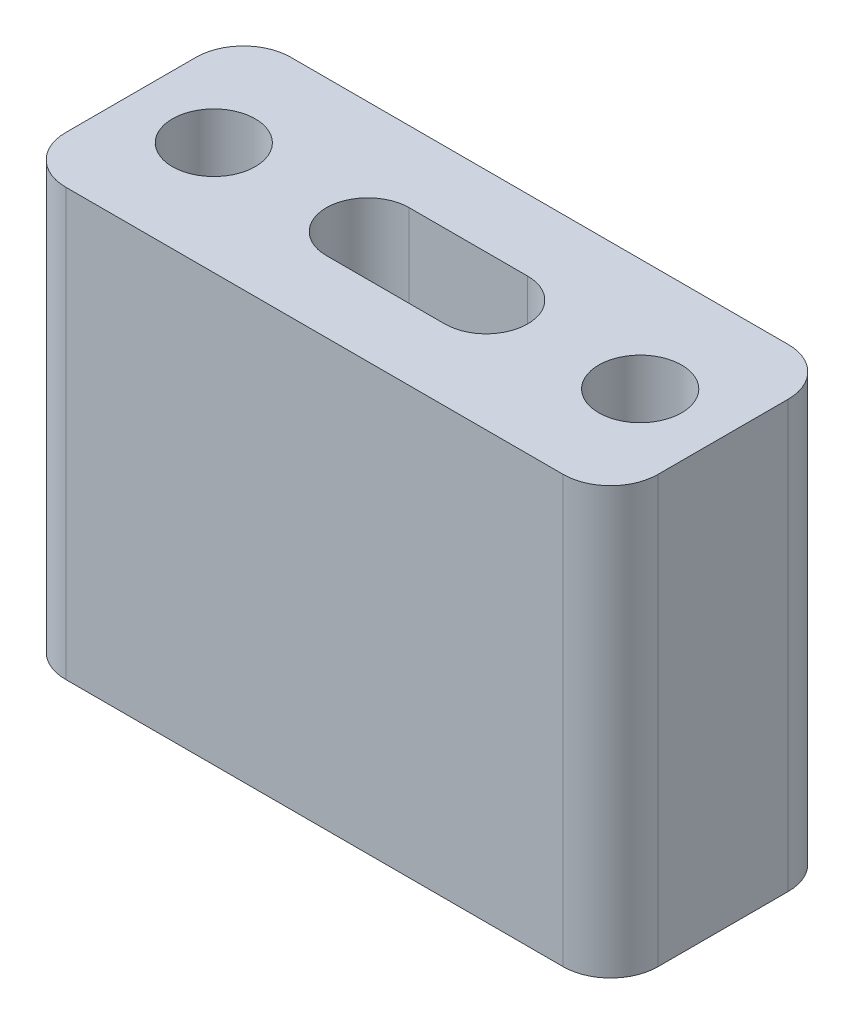
ISO-10303-21;
HEADER;
FILE_DESCRIPTION(('STEP AP214'),'2;1');
FILE_NAME('part.step','',(''),(''),'','','');
FILE_SCHEMA(('AUTOMOTIVE_DESIGN { 1 0 10303 214 1 1 1 1 }'));
ENDSEC;
DATA;
#1=APPLICATION_CONTEXT('core data for automotive mechanical design processes');
#2=APPLICATION_PROTOCOL_DEFINITION('international standard','automotive_design',2000,#1);
#3=PRODUCT_CONTEXT('',#1,'mechanical');
#4=PRODUCT('Part','Part','',(#3));
#5=PRODUCT_RELATED_PRODUCT_CATEGORY('part','',(#4));
#6=PRODUCT_DEFINITION_FORMATION('','',#4);
#7=PRODUCT_DEFINITION_CONTEXT('part definition',#1,'design');
#8=PRODUCT_DEFINITION('design','',#6,#7);
#9=PRODUCT_DEFINITION_SHAPE('','',#8);
#10=(LENGTH_UNIT() NAMED_UNIT(*) SI_UNIT(.MILLI.,.METRE.));
#11=(NAMED_UNIT(*) PLANE_ANGLE_UNIT() SI_UNIT($,.RADIAN.));
#12=(NAMED_UNIT(*) SI_UNIT($,.STERADIAN.) SOLID_ANGLE_UNIT());
#13=UNCERTAINTY_MEASURE_WITH_UNIT(LENGTH_MEASURE(1.E-05),#10,'distance_accuracy_value','');
#14=(GEOMETRIC_REPRESENTATION_CONTEXT(3) GLOBAL_UNCERTAINTY_ASSIGNED_CONTEXT((#13)) GLOBAL_UNIT_ASSIGNED_CONTEXT((#10,
#11,#12)) REPRESENTATION_CONTEXT('',''));
#15=CARTESIAN_POINT('',(0.,0.,0.));
#16=DIRECTION('',(0.,0.,1.));
#17=DIRECTION('',(1.,0.,0.));
#18=AXIS2_PLACEMENT_3D('',#15,#16,#17);
#19=CARTESIAN_POINT('',(0.,18.,0.));
#20=DIRECTION('',(0.,1.,0.));
#21=DIRECTION('',(0.,0.,1.));
#22=AXIS2_PLACEMENT_3D('',#19,#20,#21);
#23=PLANE('',#22);
#24=CARTESIAN_POINT('',(-9.,18.,0.));
#25=DIRECTION('',(0.,1.,0.));
#26=DIRECTION('',(0.,0.,1.));
#27=AXIS2_PLACEMENT_3D('',#24,#25,#26);
#28=CIRCLE('',#27,1.75);
#29=CARTESIAN_POINT('',(-9.,18.,1.75));
#30=VERTEX_POINT('',#29);
#31=EDGE_CURVE('E176',#30,#30,#28,.T.);
#32=ORIENTED_EDGE('',*,*,#31,.F.);
#33=EDGE_LOOP('',(#32));
#34=FACE_BOUND('',#33,.T.);
#35=DIRECTION('',(0.,0.,1.));
#36=VECTOR('',#35,1.);
#37=CARTESIAN_POINT('',(-12.5,18.,-4.75));
#38=LINE('',#37,#36);
#39=CARTESIAN_POINT('',(-12.5,18.,-2.75));
#40=VERTEX_POINT('',#39);
#41=CARTESIAN_POINT('',(-12.5,18.,2.75));
#42=VERTEX_POINT('',#41);
#43=EDGE_CURVE('E187',#40,#42,#38,.T.);
#44=ORIENTED_EDGE('',*,*,#43,.T.);
#45=CARTESIAN_POINT('',(-10.5,18.,2.75));
#46=DIRECTION('',(0.,1.,0.));
#47=DIRECTION('',(0.,0.,1.));
#48=AXIS2_PLACEMENT_3D('',#45,#46,#47);
#49=CIRCLE('',#48,2.);
#50=CARTESIAN_POINT('',(-10.5,18.,4.75));
#51=VERTEX_POINT('',#50);
#52=EDGE_CURVE('E225',#42,#51,#49,.T.);
#53=ORIENTED_EDGE('',*,*,#52,.T.);
#54=DIRECTION('',(1.,0.,0.));
#55=VECTOR('',#54,1.);
#56=CARTESIAN_POINT('',(-12.5,18.,4.75));
#57=LINE('',#56,#55);
#58=CARTESIAN_POINT('',(10.5,18.,4.75));
#59=VERTEX_POINT('',#58);
#60=EDGE_CURVE('E190',#51,#59,#57,.T.);
#61=ORIENTED_EDGE('',*,*,#60,.T.);
#62=CARTESIAN_POINT('',(10.5,18.,2.75));
#63=DIRECTION('',(0.,1.,0.));
#64=DIRECTION('',(0.,0.,1.));
#65=AXIS2_PLACEMENT_3D('',#62,#63,#64);
#66=CIRCLE('',#65,2.);
#67=CARTESIAN_POINT('',(12.5,18.,2.75));
#68=VERTEX_POINT('',#67);
#69=EDGE_CURVE('E220',#59,#68,#66,.T.);
#70=ORIENTED_EDGE('',*,*,#69,.T.);
#71=DIRECTION('',(0.,0.,-1.));
#72=VECTOR('',#71,1.);
#73=CARTESIAN_POINT('',(12.5,18.,-4.75));
#74=LINE('',#73,#72);
#75=CARTESIAN_POINT('',(12.5,18.,-2.75));
#76=VERTEX_POINT('',#75);
#77=EDGE_CURVE('E182',#68,#76,#74,.T.);
#78=ORIENTED_EDGE('',*,*,#77,.T.);
#79=CARTESIAN_POINT('',(10.5,18.,-2.75));
#80=DIRECTION('',(0.,1.,0.));
#81=DIRECTION('',(0.,0.,1.));
#82=AXIS2_PLACEMENT_3D('',#79,#80,#81);
#83=CIRCLE('',#82,2.);
#84=CARTESIAN_POINT('',(10.5,18.,-4.75));
#85=VERTEX_POINT('',#84);
#86=EDGE_CURVE('E60',#76,#85,#83,.T.);
#87=ORIENTED_EDGE('',*,*,#86,.T.);
#88=DIRECTION('',(-1.,0.,0.));
#89=VECTOR('',#88,1.);
#90=CARTESIAN_POINT('',(-12.5,18.,-4.75));
#91=LINE('',#90,#89);
#92=CARTESIAN_POINT('',(-10.5,18.,-4.75));
#93=VERTEX_POINT('',#92);
#94=EDGE_CURVE('E184',#85,#93,#91,.T.);
#95=ORIENTED_EDGE('',*,*,#94,.T.);
#96=CARTESIAN_POINT('',(-10.5,18.,-2.75));
#97=DIRECTION('',(0.,1.,0.));
#98=DIRECTION('',(0.,0.,1.));
#99=AXIS2_PLACEMENT_3D('',#96,#97,#98);
#100=CIRCLE('',#99,2.);
#101=EDGE_CURVE('E223',#93,#40,#100,.T.);
#102=ORIENTED_EDGE('',*,*,#101,.T.);
#103=EDGE_LOOP('',(#44,#53,#61,#70,#78,#87,#95,#102));
#104=FACE_BOUND('',#103,.T.);
#105=CARTESIAN_POINT('',(9.,18.,0.));
#106=DIRECTION('',(0.,1.,0.));
#107=DIRECTION('',(0.,0.,1.));
#108=AXIS2_PLACEMENT_3D('',#105,#106,#107);
#109=CIRCLE('',#108,1.75);
#110=CARTESIAN_POINT('',(9.,18.,1.75));
#111=VERTEX_POINT('',#110);
#112=EDGE_CURVE('E170',#111,#111,#109,.T.);
#113=ORIENTED_EDGE('',*,*,#112,.F.);
#114=EDGE_LOOP('',(#113));
#115=FACE_BOUND('',#114,.T.);
#116=DIRECTION('',(1.,0.,0.));
#117=VECTOR('',#116,1.);
#118=CARTESIAN_POINT('',(-2.5,18.,1.75));
#119=LINE('',#118,#117);
#120=CARTESIAN_POINT('',(-2.5,18.,1.75));
#121=VERTEX_POINT('',#120);
#122=CARTESIAN_POINT('',(2.5,18.,1.75));
#123=VERTEX_POINT('',#122);
#124=EDGE_CURVE('E139',#121,#123,#119,.T.);
#125=ORIENTED_EDGE('',*,*,#124,.F.);
#126=CARTESIAN_POINT('',(-2.5,18.,0.));
#127=DIRECTION('',(0.,1.,0.));
#128=DIRECTION('',(0.,0.,1.));
#129=AXIS2_PLACEMENT_3D('',#126,#127,#128);
#130=CIRCLE('',#129,1.75);
#131=CARTESIAN_POINT('',(-2.5,18.,-1.75));
#132=VERTEX_POINT('',#131);
#133=EDGE_CURVE('E129',#132,#121,#130,.T.);
#134=ORIENTED_EDGE('',*,*,#133,.F.);
#135=DIRECTION('',(-1.,0.,0.));
#136=VECTOR('',#135,1.);
#137=CARTESIAN_POINT('',(-2.5,18.,-1.75));
#138=LINE('',#137,#136);
#139=CARTESIAN_POINT('',(2.5,18.,-1.75));
#140=VERTEX_POINT('',#139);
#141=EDGE_CURVE('E154',#140,#132,#138,.T.);
#142=ORIENTED_EDGE('',*,*,#141,.F.);
#143=CARTESIAN_POINT('',(2.5,18.,0.));
#144=DIRECTION('',(0.,1.,0.));
#145=DIRECTION('',(0.,0.,1.));
#146=AXIS2_PLACEMENT_3D('',#143,#144,#145);
#147=CIRCLE('',#146,1.75);
#148=EDGE_CURVE('E152',#123,#140,#147,.T.);
#149=ORIENTED_EDGE('',*,*,#148,.F.);
#150=EDGE_LOOP('',(#125,#134,#142,#149));
#151=FACE_BOUND('',#150,.T.);
#152=ADVANCED_FACE('F38',(#34,#104,#115,#151),#23,.T.);
#153=CARTESIAN_POINT('',(0.,0.,0.));
#154=DIRECTION('',(0.,1.,0.));
#155=DIRECTION('',(0.,0.,1.));
#156=AXIS2_PLACEMENT_3D('',#153,#154,#155);
#157=PLANE('',#156);
#158=CARTESIAN_POINT('',(9.,0.,0.));
#159=DIRECTION('',(0.,1.,0.));
#160=DIRECTION('',(0.,0.,1.));
#161=AXIS2_PLACEMENT_3D('',#158,#159,#160);
#162=CIRCLE('',#161,1.75);
#163=CARTESIAN_POINT('',(9.,0.,1.75));
#164=VERTEX_POINT('',#163);
#165=EDGE_CURVE('E147',#164,#164,#162,.T.);
#166=ORIENTED_EDGE('',*,*,#165,.T.);
#167=EDGE_LOOP('',(#166));
#168=FACE_BOUND('',#167,.T.);
#169=CARTESIAN_POINT('',(-9.,0.,0.));
#170=DIRECTION('',(0.,1.,0.));
#171=DIRECTION('',(0.,0.,1.));
#172=AXIS2_PLACEMENT_3D('',#169,#170,#171);
#173=CIRCLE('',#172,1.75);
#174=CARTESIAN_POINT('',(-9.,0.,1.75));
#175=VERTEX_POINT('',#174);
#176=EDGE_CURVE('E173',#175,#175,#173,.T.);
#177=ORIENTED_EDGE('',*,*,#176,.T.);
#178=EDGE_LOOP('',(#177));
#179=FACE_BOUND('',#178,.T.);
#180=DIRECTION('',(1.,0.,0.));
#181=VECTOR('',#180,1.);
#182=CARTESIAN_POINT('',(-12.5,0.,4.75));
#183=LINE('',#182,#181);
#184=CARTESIAN_POINT('',(-10.5,0.,4.75));
#185=VERTEX_POINT('',#184);
#186=CARTESIAN_POINT('',(10.5,0.,4.75));
#187=VERTEX_POINT('',#186);
#188=EDGE_CURVE('E185',#185,#187,#183,.T.);
#189=ORIENTED_EDGE('',*,*,#188,.F.);
#190=CARTESIAN_POINT('',(-10.5,0.,2.75));
#191=DIRECTION('',(0.,1.,0.));
#192=DIRECTION('',(0.,0.,1.));
#193=AXIS2_PLACEMENT_3D('',#190,#191,#192);
#194=CIRCLE('',#193,2.);
#195=CARTESIAN_POINT('',(-12.5,0.,2.75));
#196=VERTEX_POINT('',#195);
#197=EDGE_CURVE('E213',#185,#196,#194,.F.);
#198=ORIENTED_EDGE('',*,*,#197,.T.);
#199=DIRECTION('',(0.,0.,1.));
#200=VECTOR('',#199,1.);
#201=CARTESIAN_POINT('',(-12.5,0.,-4.75));
#202=LINE('',#201,#200);
#203=CARTESIAN_POINT('',(-12.5,0.,-2.75));
#204=VERTEX_POINT('',#203);
#205=EDGE_CURVE('E198',#204,#196,#202,.T.);
#206=ORIENTED_EDGE('',*,*,#205,.F.);
#207=CARTESIAN_POINT('',(-10.5,0.,-2.75));
#208=DIRECTION('',(0.,1.,0.));
#209=DIRECTION('',(0.,0.,1.));
#210=AXIS2_PLACEMENT_3D('',#207,#208,#209);
#211=CIRCLE('',#210,2.);
#212=CARTESIAN_POINT('',(-10.5,0.,-4.75));
#213=VERTEX_POINT('',#212);
#214=EDGE_CURVE('E211',#204,#213,#211,.F.);
#215=ORIENTED_EDGE('',*,*,#214,.T.);
#216=DIRECTION('',(-1.,0.,0.));
#217=VECTOR('',#216,1.);
#218=CARTESIAN_POINT('',(-12.5,0.,-4.75));
#219=LINE('',#218,#217);
#220=CARTESIAN_POINT('',(10.5,0.,-4.75));
#221=VERTEX_POINT('',#220);
#222=EDGE_CURVE('E196',#221,#213,#219,.T.);
#223=ORIENTED_EDGE('',*,*,#222,.F.);
#224=CARTESIAN_POINT('',(10.5,0.,-2.75));
#225=DIRECTION('',(0.,1.,0.));
#226=DIRECTION('',(0.,0.,1.));
#227=AXIS2_PLACEMENT_3D('',#224,#225,#226);
#228=CIRCLE('',#227,2.);
#229=CARTESIAN_POINT('',(12.5,0.,-2.75));
#230=VERTEX_POINT('',#229);
#231=EDGE_CURVE('E209',#221,#230,#228,.F.);
#232=ORIENTED_EDGE('',*,*,#231,.T.);
#233=DIRECTION('',(0.,0.,-1.));
#234=VECTOR('',#233,1.);
#235=CARTESIAN_POINT('',(12.5,0.,-4.75));
#236=LINE('',#235,#234);
#237=CARTESIAN_POINT('',(12.5,0.,2.75));
#238=VERTEX_POINT('',#237);
#239=EDGE_CURVE('E179',#238,#230,#236,.T.);
#240=ORIENTED_EDGE('',*,*,#239,.F.);
#241=CARTESIAN_POINT('',(10.5,0.,2.75));
#242=DIRECTION('',(0.,1.,0.));
#243=DIRECTION('',(0.,0.,1.));
#244=AXIS2_PLACEMENT_3D('',#241,#242,#243);
#245=CIRCLE('',#244,2.);
#246=EDGE_CURVE('E207',#238,#187,#245,.F.);
#247=ORIENTED_EDGE('',*,*,#246,.T.);
#248=EDGE_LOOP('',(#189,#198,#206,#215,#223,#232,#240,#247));
#249=FACE_BOUND('',#248,.T.);
#250=CARTESIAN_POINT('',(-2.5,0.,0.));
#251=DIRECTION('',(0.,1.,0.));
#252=DIRECTION('',(0.,0.,1.));
#253=AXIS2_PLACEMENT_3D('',#250,#251,#252);
#254=CIRCLE('',#253,1.75);
#255=CARTESIAN_POINT('',(-2.5,0.,-1.75));
#256=VERTEX_POINT('',#255);
#257=CARTESIAN_POINT('',(-2.5,0.,1.75));
#258=VERTEX_POINT('',#257);
#259=EDGE_CURVE('E158',#256,#258,#254,.T.);
#260=ORIENTED_EDGE('',*,*,#259,.T.);
#261=DIRECTION('',(1.,0.,0.));
#262=VECTOR('',#261,1.);
#263=CARTESIAN_POINT('',(-2.5,0.,1.75));
#264=LINE('',#263,#262);
#265=CARTESIAN_POINT('',(2.5,0.,1.75));
#266=VERTEX_POINT('',#265);
#267=EDGE_CURVE('E146',#258,#266,#264,.T.);
#268=ORIENTED_EDGE('',*,*,#267,.T.);
#269=CARTESIAN_POINT('',(2.5,0.,0.));
#270=DIRECTION('',(0.,1.,0.));
#271=DIRECTION('',(0.,0.,1.));
#272=AXIS2_PLACEMENT_3D('',#269,#270,#271);
#273=CIRCLE('',#272,1.75);
#274=CARTESIAN_POINT('',(2.5,0.,-1.75));
#275=VERTEX_POINT('',#274);
#276=EDGE_CURVE('E161',#266,#275,#273,.T.);
#277=ORIENTED_EDGE('',*,*,#276,.T.);
#278=DIRECTION('',(-1.,0.,0.));
#279=VECTOR('',#278,1.);
#280=CARTESIAN_POINT('',(-2.5,0.,-1.75));
#281=LINE('',#280,#279);
#282=EDGE_CURVE('E140',#275,#256,#281,.T.);
#283=ORIENTED_EDGE('',*,*,#282,.T.);
#284=EDGE_LOOP('',(#260,#268,#277,#283));
#285=FACE_BOUND('',#284,.T.);
#286=ADVANCED_FACE('F241',(#168,#179,#249,#285),#157,.F.);
#287=CARTESIAN_POINT('',(12.5,18.,-4.75));
#288=DIRECTION('',(-1.,0.,0.));
#289=DIRECTION('',(0.,0.,1.));
#290=AXIS2_PLACEMENT_3D('',#287,#288,#289);
#291=PLANE('',#290);
#292=ORIENTED_EDGE('',*,*,#239,.T.);
#293=DIRECTION('',(0.,-1.,0.));
#294=VECTOR('',#293,1.);
#295=CARTESIAN_POINT('',(12.5,18.,-2.75));
#296=LINE('',#295,#294);
#297=EDGE_CURVE('E11',#230,#76,#296,.F.);
#298=ORIENTED_EDGE('',*,*,#297,.T.);
#299=ORIENTED_EDGE('',*,*,#77,.F.);
#300=DIRECTION('',(0.,-1.,0.));
#301=VECTOR('',#300,1.);
#302=CARTESIAN_POINT('',(12.5,18.,2.75));
#303=LINE('',#302,#301);
#304=EDGE_CURVE('E46',#68,#238,#303,.T.);
#305=ORIENTED_EDGE('',*,*,#304,.T.);
#306=EDGE_LOOP('',(#292,#298,#299,#305));
#307=FACE_BOUND('',#306,.T.);
#308=ADVANCED_FACE('F235',(#307),#291,.F.);
#309=CARTESIAN_POINT('',(-12.5,18.,-4.75));
#310=DIRECTION('',(0.,0.,1.));
#311=DIRECTION('',(1.,0.,0.));
#312=AXIS2_PLACEMENT_3D('',#309,#310,#311);
#313=PLANE('',#312);
#314=ORIENTED_EDGE('',*,*,#222,.T.);
#315=DIRECTION('',(0.,-1.,0.));
#316=VECTOR('',#315,1.);
#317=CARTESIAN_POINT('',(-10.5,18.,-4.75));
#318=LINE('',#317,#316);
#319=EDGE_CURVE('E53',#213,#93,#318,.F.);
#320=ORIENTED_EDGE('',*,*,#319,.T.);
#321=ORIENTED_EDGE('',*,*,#94,.F.);
#322=DIRECTION('',(0.,-1.,0.));
#323=VECTOR('',#322,1.);
#324=CARTESIAN_POINT('',(10.5,18.,-4.75));
#325=LINE('',#324,#323);
#326=EDGE_CURVE('E227',#85,#221,#325,.T.);
#327=ORIENTED_EDGE('',*,*,#326,.T.);
#328=EDGE_LOOP('',(#314,#320,#321,#327));
#329=FACE_BOUND('',#328,.T.);
#330=ADVANCED_FACE('F247',(#329),#313,.F.);
#331=CARTESIAN_POINT('',(-12.5,18.,-4.75));
#332=DIRECTION('',(1.,0.,0.));
#333=DIRECTION('',(0.,0.,-1.));
#334=AXIS2_PLACEMENT_3D('',#331,#332,#333);
#335=PLANE('',#334);
#336=ORIENTED_EDGE('',*,*,#205,.T.);
#337=DIRECTION('',(0.,-1.,0.));
#338=VECTOR('',#337,1.);
#339=CARTESIAN_POINT('',(-12.5,18.,2.75));
#340=LINE('',#339,#338);
#341=EDGE_CURVE('E218',#196,#42,#340,.F.);
#342=ORIENTED_EDGE('',*,*,#341,.T.);
#343=ORIENTED_EDGE('',*,*,#43,.F.);
#344=DIRECTION('',(0.,-1.,0.));
#345=VECTOR('',#344,1.);
#346=CARTESIAN_POINT('',(-12.5,18.,-2.75));
#347=LINE('',#346,#345);
#348=EDGE_CURVE('E215',#40,#204,#347,.T.);
#349=ORIENTED_EDGE('',*,*,#348,.T.);
#350=EDGE_LOOP('',(#336,#342,#343,#349));
#351=FACE_BOUND('',#350,.T.);
#352=ADVANCED_FACE('F256',(#351),#335,.F.);
#353=CARTESIAN_POINT('',(-12.5,18.,4.75));
#354=DIRECTION('',(0.,0.,-1.));
#355=DIRECTION('',(-1.,0.,0.));
#356=AXIS2_PLACEMENT_3D('',#353,#354,#355);
#357=PLANE('',#356);
#358=ORIENTED_EDGE('',*,*,#60,.F.);
#359=DIRECTION('',(0.,-1.,0.));
#360=VECTOR('',#359,1.);
#361=CARTESIAN_POINT('',(-10.5,18.,4.75));
#362=LINE('',#361,#360);
#363=EDGE_CURVE('E204',#51,#185,#362,.T.);
#364=ORIENTED_EDGE('',*,*,#363,.T.);
#365=ORIENTED_EDGE('',*,*,#188,.T.);
#366=DIRECTION('',(0.,-1.,0.));
#367=VECTOR('',#366,1.);
#368=CARTESIAN_POINT('',(10.5,18.,4.75));
#369=LINE('',#368,#367);
#370=EDGE_CURVE('E193',#187,#59,#369,.F.);
#371=ORIENTED_EDGE('',*,*,#370,.T.);
#372=EDGE_LOOP('',(#358,#364,#365,#371));
#373=FACE_BOUND('',#372,.T.);
#374=ADVANCED_FACE('F264',(#373),#357,.F.);
#375=CARTESIAN_POINT('',(-9.,18.,0.));
#376=DIRECTION('',(0.,-1.,0.));
#377=DIRECTION('',(0.,0.,-1.));
#378=AXIS2_PLACEMENT_3D('',#375,#376,#377);
#379=CYLINDRICAL_SURFACE('',#378,1.75);
#380=ORIENTED_EDGE('',*,*,#31,.T.);
#381=EDGE_LOOP('',(#380));
#382=FACE_BOUND('',#381,.T.);
#383=ORIENTED_EDGE('',*,*,#176,.F.);
#384=EDGE_LOOP('',(#383));
#385=FACE_BOUND('',#384,.T.);
#386=ADVANCED_FACE('F280',(#382,#385),#379,.F.);
#387=CARTESIAN_POINT('',(9.,18.,0.));
#388=DIRECTION('',(0.,-1.,0.));
#389=DIRECTION('',(0.,0.,-1.));
#390=AXIS2_PLACEMENT_3D('',#387,#388,#389);
#391=CYLINDRICAL_SURFACE('',#390,1.75);
#392=ORIENTED_EDGE('',*,*,#112,.T.);
#393=EDGE_LOOP('',(#392));
#394=FACE_BOUND('',#393,.T.);
#395=ORIENTED_EDGE('',*,*,#165,.F.);
#396=EDGE_LOOP('',(#395));
#397=FACE_BOUND('',#396,.T.);
#398=ADVANCED_FACE('F356',(#394,#397),#391,.F.);
#399=CARTESIAN_POINT('',(-2.5,18.,0.));
#400=DIRECTION('',(0.,-1.,0.));
#401=DIRECTION('',(0.,0.,-1.));
#402=AXIS2_PLACEMENT_3D('',#399,#400,#401);
#403=CYLINDRICAL_SURFACE('',#402,1.75);
#404=ORIENTED_EDGE('',*,*,#259,.F.);
#405=DIRECTION('',(0.,-1.,0.));
#406=VECTOR('',#405,1.);
#407=CARTESIAN_POINT('',(-2.5,18.,-1.75));
#408=LINE('',#407,#406);
#409=EDGE_CURVE('E135',#132,#256,#408,.T.);
#410=ORIENTED_EDGE('',*,*,#409,.F.);
#411=ORIENTED_EDGE('',*,*,#133,.T.);
#412=DIRECTION('',(0.,-1.,0.));
#413=VECTOR('',#412,1.);
#414=CARTESIAN_POINT('',(-2.5,18.,1.75));
#415=LINE('',#414,#413);
#416=EDGE_CURVE('E132',#121,#258,#415,.T.);
#417=ORIENTED_EDGE('',*,*,#416,.T.);
#418=EDGE_LOOP('',(#404,#410,#411,#417));
#419=FACE_BOUND('',#418,.T.);
#420=ADVANCED_FACE('F131',(#419),#403,.F.);
#421=CARTESIAN_POINT('',(-2.5,18.,1.75));
#422=DIRECTION('',(0.,0.,-1.));
#423=DIRECTION('',(-1.,0.,0.));
#424=AXIS2_PLACEMENT_3D('',#421,#422,#423);
#425=PLANE('',#424);
#426=ORIENTED_EDGE('',*,*,#267,.F.);
#427=ORIENTED_EDGE('',*,*,#416,.F.);
#428=ORIENTED_EDGE('',*,*,#124,.T.);
#429=DIRECTION('',(0.,-1.,0.));
#430=VECTOR('',#429,1.);
#431=CARTESIAN_POINT('',(2.5,18.,1.75));
#432=LINE('',#431,#430);
#433=EDGE_CURVE('E148',#123,#266,#432,.T.);
#434=ORIENTED_EDGE('',*,*,#433,.T.);
#435=EDGE_LOOP('',(#426,#427,#428,#434));
#436=FACE_BOUND('',#435,.T.);
#437=ADVANCED_FACE('F143',(#436),#425,.T.);
#438=CARTESIAN_POINT('',(2.5,18.,0.));
#439=DIRECTION('',(0.,-1.,0.));
#440=DIRECTION('',(0.,0.,-1.));
#441=AXIS2_PLACEMENT_3D('',#438,#439,#440);
#442=CYLINDRICAL_SURFACE('',#441,1.75);
#443=ORIENTED_EDGE('',*,*,#276,.F.);
#444=ORIENTED_EDGE('',*,*,#433,.F.);
#445=ORIENTED_EDGE('',*,*,#148,.T.);
#446=DIRECTION('',(0.,-1.,0.));
#447=VECTOR('',#446,1.);
#448=CARTESIAN_POINT('',(2.5,18.,-1.75));
#449=LINE('',#448,#447);
#450=EDGE_CURVE('E167',#140,#275,#449,.T.);
#451=ORIENTED_EDGE('',*,*,#450,.T.);
#452=EDGE_LOOP('',(#443,#444,#445,#451));
#453=FACE_BOUND('',#452,.T.);
#454=ADVANCED_FACE('F329',(#453),#442,.F.);
#455=CARTESIAN_POINT('',(-2.5,18.,-1.75));
#456=DIRECTION('',(0.,0.,1.));
#457=DIRECTION('',(1.,0.,0.));
#458=AXIS2_PLACEMENT_3D('',#455,#456,#457);
#459=PLANE('',#458);
#460=ORIENTED_EDGE('',*,*,#282,.F.);
#461=ORIENTED_EDGE('',*,*,#450,.F.);
#462=ORIENTED_EDGE('',*,*,#141,.T.);
#463=ORIENTED_EDGE('',*,*,#409,.T.);
#464=EDGE_LOOP('',(#460,#461,#462,#463));
#465=FACE_BOUND('',#464,.T.);
#466=ADVANCED_FACE('F293',(#465),#459,.T.);
#467=CARTESIAN_POINT('',(-10.5,18.,2.75));
#468=DIRECTION('',(0.,-1.,0.));
#469=DIRECTION('',(0.,0.,-1.));
#470=AXIS2_PLACEMENT_3D('',#467,#468,#469);
#471=CYLINDRICAL_SURFACE('',#470,2.);
#472=ORIENTED_EDGE('',*,*,#52,.F.);
#473=ORIENTED_EDGE('',*,*,#341,.F.);
#474=ORIENTED_EDGE('',*,*,#197,.F.);
#475=ORIENTED_EDGE('',*,*,#363,.F.);
#476=EDGE_LOOP('',(#472,#473,#474,#475));
#477=FACE_BOUND('',#476,.T.);
#478=ADVANCED_FACE('F261',(#477),#471,.T.);
#479=CARTESIAN_POINT('',(-10.5,18.,-2.75));
#480=DIRECTION('',(0.,-1.,0.));
#481=DIRECTION('',(0.,0.,-1.));
#482=AXIS2_PLACEMENT_3D('',#479,#480,#481);
#483=CYLINDRICAL_SURFACE('',#482,2.);
#484=ORIENTED_EDGE('',*,*,#101,.F.);
#485=ORIENTED_EDGE('',*,*,#319,.F.);
#486=ORIENTED_EDGE('',*,*,#214,.F.);
#487=ORIENTED_EDGE('',*,*,#348,.F.);
#488=EDGE_LOOP('',(#484,#485,#486,#487));
#489=FACE_BOUND('',#488,.T.);
#490=ADVANCED_FACE('F253',(#489),#483,.T.);
#491=CARTESIAN_POINT('',(10.5,18.,-2.75));
#492=DIRECTION('',(0.,-1.,0.));
#493=DIRECTION('',(0.,0.,-1.));
#494=AXIS2_PLACEMENT_3D('',#491,#492,#493);
#495=CYLINDRICAL_SURFACE('',#494,2.);
#496=ORIENTED_EDGE('',*,*,#86,.F.);
#497=ORIENTED_EDGE('',*,*,#297,.F.);
#498=ORIENTED_EDGE('',*,*,#231,.F.);
#499=ORIENTED_EDGE('',*,*,#326,.F.);
#500=EDGE_LOOP('',(#496,#497,#498,#499));
#501=FACE_BOUND('',#500,.T.);
#502=ADVANCED_FACE('F246',(#501),#495,.T.);
#503=CARTESIAN_POINT('',(10.5,18.,2.75));
#504=DIRECTION('',(0.,-1.,0.));
#505=DIRECTION('',(0.,0.,-1.));
#506=AXIS2_PLACEMENT_3D('',#503,#504,#505);
#507=CYLINDRICAL_SURFACE('',#506,2.);
#508=ORIENTED_EDGE('',*,*,#69,.F.);
#509=ORIENTED_EDGE('',*,*,#370,.F.);
#510=ORIENTED_EDGE('',*,*,#246,.F.);
#511=ORIENTED_EDGE('',*,*,#304,.F.);
#512=EDGE_LOOP('',(#508,#509,#510,#511));
#513=FACE_BOUND('',#512,.T.);
#514=ADVANCED_FACE('F40',(#513),#507,.T.);
#515=CLOSED_SHELL('',(#152,#286,#308,#330,#352,#374,#386,#398,#420,#437,#454,#466,#478,#490,
#502,#514));
#516=MANIFOLD_SOLID_BREP('B2',#515);
#517=ADVANCED_BREP_SHAPE_REPRESENTATION('',(#18,#516),#14);
#518=SHAPE_DEFINITION_REPRESENTATION(#9,#517);
ENDSEC;
END-ISO-10303-21;
